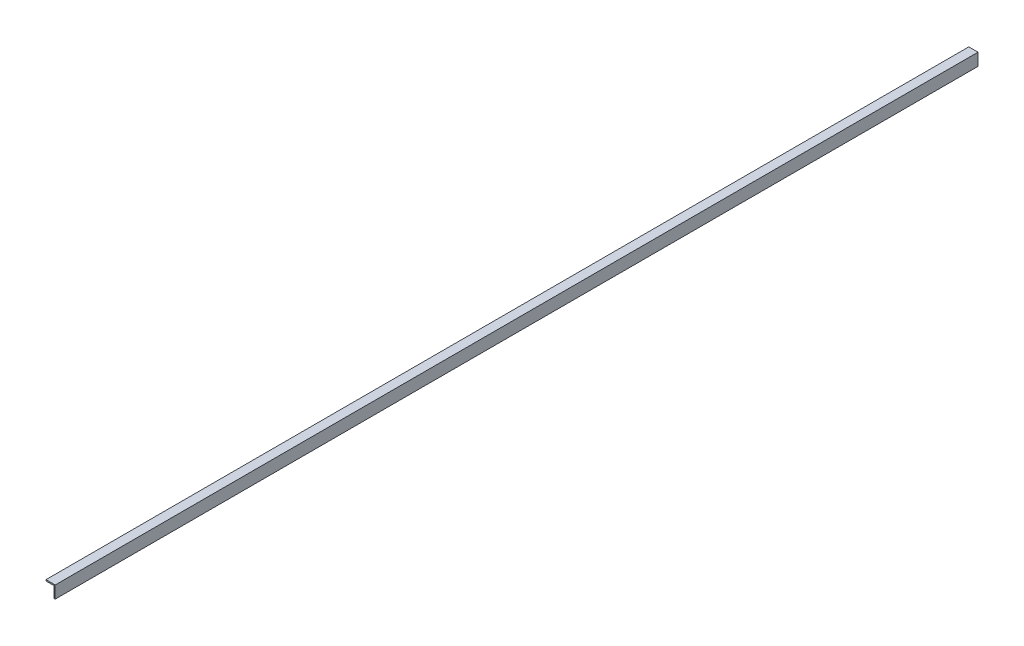
ISO-10303-21;
HEADER;
FILE_DESCRIPTION(('STEP AP214'),'2;1');
FILE_NAME('part.step','',(''),(''),'','','');
FILE_SCHEMA(('AUTOMOTIVE_DESIGN { 1 0 10303 214 1 1 1 1 }'));
ENDSEC;
DATA;
#1=APPLICATION_CONTEXT('core data for automotive mechanical design processes');
#2=APPLICATION_PROTOCOL_DEFINITION('international standard','automotive_design',2000,#1);
#3=PRODUCT_CONTEXT('',#1,'mechanical');
#4=PRODUCT('Part','Part','',(#3));
#5=PRODUCT_RELATED_PRODUCT_CATEGORY('part','',(#4));
#6=PRODUCT_DEFINITION_FORMATION('','',#4);
#7=PRODUCT_DEFINITION_CONTEXT('part definition',#1,'design');
#8=PRODUCT_DEFINITION('design','',#6,#7);
#9=PRODUCT_DEFINITION_SHAPE('','',#8);
#10=(LENGTH_UNIT() NAMED_UNIT(*) SI_UNIT(.MILLI.,.METRE.));
#11=(NAMED_UNIT(*) PLANE_ANGLE_UNIT() SI_UNIT($,.RADIAN.));
#12=(NAMED_UNIT(*) SI_UNIT($,.STERADIAN.) SOLID_ANGLE_UNIT());
#13=UNCERTAINTY_MEASURE_WITH_UNIT(LENGTH_MEASURE(1.E-05),#10,'distance_accuracy_value','');
#14=(GEOMETRIC_REPRESENTATION_CONTEXT(3) GLOBAL_UNCERTAINTY_ASSIGNED_CONTEXT((#13)) GLOBAL_UNIT_ASSIGNED_CONTEXT((#10,
#11,#12)) REPRESENTATION_CONTEXT('',''));
#15=CARTESIAN_POINT('',(0.,0.,0.));
#16=DIRECTION('',(0.,0.,1.));
#17=DIRECTION('',(1.,0.,0.));
#18=AXIS2_PLACEMENT_3D('',#15,#16,#17);
#19=CARTESIAN_POINT('',(0.,0.,750.));
#20=DIRECTION('',(1.,0.,0.));
#21=DIRECTION('',(0.,0.,-1.));
#22=AXIS2_PLACEMENT_3D('',#19,#20,#21);
#23=PLANE('',#22);
#24=DIRECTION('',(0.,-1.,0.));
#25=VECTOR('',#24,1.);
#26=CARTESIAN_POINT('',(0.,0.,-750.));
#27=LINE('',#26,#25);
#28=CARTESIAN_POINT('',(0.,0.,-750.));
#29=VERTEX_POINT('',#28);
#30=CARTESIAN_POINT('',(0.,-2.,-750.));
#31=VERTEX_POINT('',#30);
#32=EDGE_CURVE('E120',#29,#31,#27,.T.);
#33=ORIENTED_EDGE('',*,*,#32,.T.);
#34=DIRECTION('',(0.,0.,-1.));
#35=VECTOR('',#34,1.);
#36=CARTESIAN_POINT('',(0.,-2.,750.));
#37=LINE('',#36,#35);
#38=CARTESIAN_POINT('',(0.,-2.,750.));
#39=VERTEX_POINT('',#38);
#40=EDGE_CURVE('E11',#39,#31,#37,.T.);
#41=ORIENTED_EDGE('',*,*,#40,.F.);
#42=DIRECTION('',(0.,-1.,0.));
#43=VECTOR('',#42,1.);
#44=CARTESIAN_POINT('',(0.,0.,750.));
#45=LINE('',#44,#43);
#46=CARTESIAN_POINT('',(0.,0.,750.));
#47=VERTEX_POINT('',#46);
#48=EDGE_CURVE('E132',#47,#39,#45,.T.);
#49=ORIENTED_EDGE('',*,*,#48,.F.);
#50=DIRECTION('',(0.,0.,-1.));
#51=VECTOR('',#50,1.);
#52=CARTESIAN_POINT('',(0.,0.,750.));
#53=LINE('',#52,#51);
#54=EDGE_CURVE('E51',#47,#29,#53,.T.);
#55=ORIENTED_EDGE('',*,*,#54,.T.);
#56=EDGE_LOOP('',(#33,#41,#49,#55));
#57=FACE_BOUND('',#56,.T.);
#58=ADVANCED_FACE('F35',(#57),#23,.F.);
#59=CARTESIAN_POINT('',(0.,-2.,750.));
#60=DIRECTION('',(0.,1.,0.));
#61=DIRECTION('',(0.,0.,1.));
#62=AXIS2_PLACEMENT_3D('',#59,#60,#61);
#63=PLANE('',#62);
#64=DIRECTION('',(1.,0.,0.));
#65=VECTOR('',#64,1.);
#66=CARTESIAN_POINT('',(0.,-2.,-750.));
#67=LINE('',#66,#65);
#68=CARTESIAN_POINT('',(13.,-2.,-750.));
#69=VERTEX_POINT('',#68);
#70=EDGE_CURVE('E122',#31,#69,#67,.T.);
#71=ORIENTED_EDGE('',*,*,#70,.T.);
#72=DIRECTION('',(0.,0.,-1.));
#73=VECTOR('',#72,1.);
#74=CARTESIAN_POINT('',(13.,-2.,750.));
#75=LINE('',#74,#73);
#76=CARTESIAN_POINT('',(13.,-2.,750.));
#77=VERTEX_POINT('',#76);
#78=EDGE_CURVE('E43',#77,#69,#75,.T.);
#79=ORIENTED_EDGE('',*,*,#78,.F.);
#80=DIRECTION('',(1.,0.,0.));
#81=VECTOR('',#80,1.);
#82=CARTESIAN_POINT('',(0.,-2.,750.));
#83=LINE('',#82,#81);
#84=EDGE_CURVE('E83',#39,#77,#83,.T.);
#85=ORIENTED_EDGE('',*,*,#84,.F.);
#86=ORIENTED_EDGE('',*,*,#40,.T.);
#87=EDGE_LOOP('',(#71,#79,#85,#86));
#88=FACE_BOUND('',#87,.T.);
#89=ADVANCED_FACE('F152',(#88),#63,.F.);
#90=CARTESIAN_POINT('',(13.,-2.,750.));
#91=DIRECTION('',(1.,0.,0.));
#92=DIRECTION('',(0.,1.,0.));
#93=AXIS2_PLACEMENT_3D('',#90,#91,#92);
#94=PLANE('',#93);
#95=DIRECTION('',(0.,-1.,0.));
#96=VECTOR('',#95,1.);
#97=CARTESIAN_POINT('',(13.,-2.,-750.));
#98=LINE('',#97,#96);
#99=CARTESIAN_POINT('',(13.,-20.,-750.));
#100=VERTEX_POINT('',#99);
#101=EDGE_CURVE('E124',#69,#100,#98,.T.);
#102=ORIENTED_EDGE('',*,*,#101,.T.);
#103=DIRECTION('',(0.,0.,-1.));
#104=VECTOR('',#103,1.);
#105=CARTESIAN_POINT('',(13.,-20.,750.));
#106=LINE('',#105,#104);
#107=CARTESIAN_POINT('',(13.,-20.,750.));
#108=VERTEX_POINT('',#107);
#109=EDGE_CURVE('E112',#108,#100,#106,.T.);
#110=ORIENTED_EDGE('',*,*,#109,.F.);
#111=DIRECTION('',(0.,-1.,0.));
#112=VECTOR('',#111,1.);
#113=CARTESIAN_POINT('',(13.,-2.,750.));
#114=LINE('',#113,#112);
#115=EDGE_CURVE('E100',#77,#108,#114,.T.);
#116=ORIENTED_EDGE('',*,*,#115,.F.);
#117=ORIENTED_EDGE('',*,*,#78,.T.);
#118=EDGE_LOOP('',(#102,#110,#116,#117));
#119=FACE_BOUND('',#118,.T.);
#120=ADVANCED_FACE('F138',(#119),#94,.F.);
#121=CARTESIAN_POINT('',(13.,-20.,750.));
#122=DIRECTION('',(0.,1.,0.));
#123=DIRECTION('',(0.,0.,1.));
#124=AXIS2_PLACEMENT_3D('',#121,#122,#123);
#125=PLANE('',#124);
#126=DIRECTION('',(1.,0.,0.));
#127=VECTOR('',#126,1.);
#128=CARTESIAN_POINT('',(13.,-20.,-750.));
#129=LINE('',#128,#127);
#130=CARTESIAN_POINT('',(15.,-20.,-750.));
#131=VERTEX_POINT('',#130);
#132=EDGE_CURVE('E109',#100,#131,#129,.T.);
#133=ORIENTED_EDGE('',*,*,#132,.T.);
#134=DIRECTION('',(0.,0.,-1.));
#135=VECTOR('',#134,1.);
#136=CARTESIAN_POINT('',(15.,-20.,750.));
#137=LINE('',#136,#135);
#138=CARTESIAN_POINT('',(15.,-20.,750.));
#139=VERTEX_POINT('',#138);
#140=EDGE_CURVE('E106',#139,#131,#137,.T.);
#141=ORIENTED_EDGE('',*,*,#140,.F.);
#142=DIRECTION('',(1.,0.,0.));
#143=VECTOR('',#142,1.);
#144=CARTESIAN_POINT('',(13.,-20.,750.));
#145=LINE('',#144,#143);
#146=EDGE_CURVE('E93',#108,#139,#145,.T.);
#147=ORIENTED_EDGE('',*,*,#146,.F.);
#148=ORIENTED_EDGE('',*,*,#109,.T.);
#149=EDGE_LOOP('',(#133,#141,#147,#148));
#150=FACE_BOUND('',#149,.T.);
#151=ADVANCED_FACE('F107',(#150),#125,.F.);
#152=CARTESIAN_POINT('',(15.,0.,750.));
#153=DIRECTION('',(1.,0.,0.));
#154=DIRECTION('',(0.,1.,0.));
#155=AXIS2_PLACEMENT_3D('',#152,#153,#154);
#156=PLANE('',#155);
#157=DIRECTION('',(0.,-1.,0.));
#158=VECTOR('',#157,1.);
#159=CARTESIAN_POINT('',(15.,0.,-750.));
#160=LINE('',#159,#158);
#161=CARTESIAN_POINT('',(15.,0.,-750.));
#162=VERTEX_POINT('',#161);
#163=EDGE_CURVE('E127',#162,#131,#160,.T.);
#164=ORIENTED_EDGE('',*,*,#163,.F.);
#165=DIRECTION('',(0.,0.,-1.));
#166=VECTOR('',#165,1.);
#167=CARTESIAN_POINT('',(15.,0.,750.));
#168=LINE('',#167,#166);
#169=CARTESIAN_POINT('',(15.,0.,750.));
#170=VERTEX_POINT('',#169);
#171=EDGE_CURVE('E71',#170,#162,#168,.T.);
#172=ORIENTED_EDGE('',*,*,#171,.F.);
#173=DIRECTION('',(0.,-1.,0.));
#174=VECTOR('',#173,1.);
#175=CARTESIAN_POINT('',(15.,0.,750.));
#176=LINE('',#175,#174);
#177=EDGE_CURVE('E98',#170,#139,#176,.T.);
#178=ORIENTED_EDGE('',*,*,#177,.T.);
#179=ORIENTED_EDGE('',*,*,#140,.T.);
#180=EDGE_LOOP('',(#164,#172,#178,#179));
#181=FACE_BOUND('',#180,.T.);
#182=ADVANCED_FACE('F114',(#181),#156,.T.);
#183=CARTESIAN_POINT('',(0.,0.,750.));
#184=DIRECTION('',(0.,1.,0.));
#185=DIRECTION('',(0.,0.,1.));
#186=AXIS2_PLACEMENT_3D('',#183,#184,#185);
#187=PLANE('',#186);
#188=DIRECTION('',(1.,0.,0.));
#189=VECTOR('',#188,1.);
#190=CARTESIAN_POINT('',(0.,0.,-750.));
#191=LINE('',#190,#189);
#192=EDGE_CURVE('E129',#29,#162,#191,.T.);
#193=ORIENTED_EDGE('',*,*,#192,.F.);
#194=ORIENTED_EDGE('',*,*,#54,.F.);
#195=DIRECTION('',(1.,0.,0.));
#196=VECTOR('',#195,1.);
#197=CARTESIAN_POINT('',(0.,0.,750.));
#198=LINE('',#197,#196);
#199=EDGE_CURVE('E115',#47,#170,#198,.T.);
#200=ORIENTED_EDGE('',*,*,#199,.T.);
#201=ORIENTED_EDGE('',*,*,#171,.T.);
#202=EDGE_LOOP('',(#193,#194,#200,#201));
#203=FACE_BOUND('',#202,.T.);
#204=ADVANCED_FACE('F141',(#203),#187,.T.);
#205=CARTESIAN_POINT('',(0.,0.,750.));
#206=DIRECTION('',(0.,0.,1.));
#207=DIRECTION('',(1.,0.,0.));
#208=AXIS2_PLACEMENT_3D('',#205,#206,#207);
#209=PLANE('',#208);
#210=ORIENTED_EDGE('',*,*,#48,.T.);
#211=ORIENTED_EDGE('',*,*,#84,.T.);
#212=ORIENTED_EDGE('',*,*,#115,.T.);
#213=ORIENTED_EDGE('',*,*,#146,.T.);
#214=ORIENTED_EDGE('',*,*,#177,.F.);
#215=ORIENTED_EDGE('',*,*,#199,.F.);
#216=EDGE_LOOP('',(#210,#211,#212,#213,#214,#215));
#217=FACE_BOUND('',#216,.T.);
#218=ADVANCED_FACE('F95',(#217),#209,.T.);
#219=CARTESIAN_POINT('',(0.,0.,-750.));
#220=DIRECTION('',(0.,0.,1.));
#221=DIRECTION('',(1.,0.,0.));
#222=AXIS2_PLACEMENT_3D('',#219,#220,#221);
#223=PLANE('',#222);
#224=ORIENTED_EDGE('',*,*,#32,.F.);
#225=ORIENTED_EDGE('',*,*,#192,.T.);
#226=ORIENTED_EDGE('',*,*,#163,.T.);
#227=ORIENTED_EDGE('',*,*,#132,.F.);
#228=ORIENTED_EDGE('',*,*,#101,.F.);
#229=ORIENTED_EDGE('',*,*,#70,.F.);
#230=EDGE_LOOP('',(#224,#225,#226,#227,#228,#229));
#231=FACE_BOUND('',#230,.T.);
#232=ADVANCED_FACE('F140',(#231),#223,.F.);
#233=CLOSED_SHELL('',(#58,#89,#120,#151,#182,#204,#218,#232));
#234=MANIFOLD_SOLID_BREP('B2',#233);
#235=ADVANCED_BREP_SHAPE_REPRESENTATION('',(#18,#234),#14);
#236=SHAPE_DEFINITION_REPRESENTATION(#9,#235);
ENDSEC;
END-ISO-10303-21;
